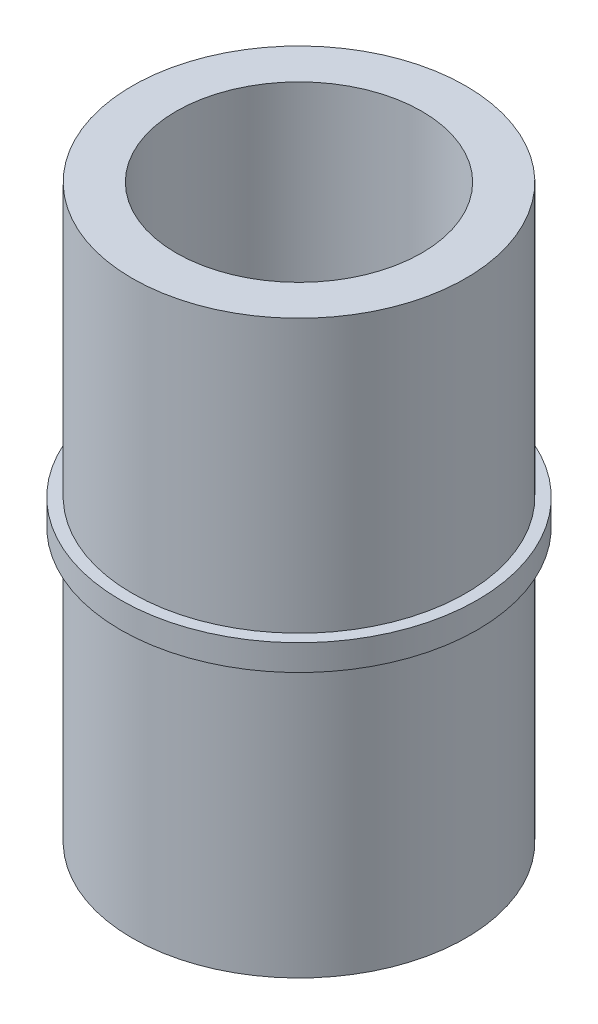
ISO-10303-21;
HEADER;
FILE_DESCRIPTION(('STEP AP214'),'2;1');
FILE_NAME('part.step','',(''),(''),'','','');
FILE_SCHEMA(('AUTOMOTIVE_DESIGN { 1 0 10303 214 1 1 1 1 }'));
ENDSEC;
DATA;
#1=APPLICATION_CONTEXT('core data for automotive mechanical design processes');
#2=APPLICATION_PROTOCOL_DEFINITION('international standard','automotive_design',2000,#1);
#3=PRODUCT_CONTEXT('',#1,'mechanical');
#4=PRODUCT('Part','Part','',(#3));
#5=PRODUCT_RELATED_PRODUCT_CATEGORY('part','',(#4));
#6=PRODUCT_DEFINITION_FORMATION('','',#4);
#7=PRODUCT_DEFINITION_CONTEXT('part definition',#1,'design');
#8=PRODUCT_DEFINITION('design','',#6,#7);
#9=PRODUCT_DEFINITION_SHAPE('','',#8);
#10=(LENGTH_UNIT() NAMED_UNIT(*) SI_UNIT(.MILLI.,.METRE.));
#11=(NAMED_UNIT(*) PLANE_ANGLE_UNIT() SI_UNIT($,.RADIAN.));
#12=(NAMED_UNIT(*) SI_UNIT($,.STERADIAN.) SOLID_ANGLE_UNIT());
#13=UNCERTAINTY_MEASURE_WITH_UNIT(LENGTH_MEASURE(1.E-05),#10,'distance_accuracy_value','');
#14=(GEOMETRIC_REPRESENTATION_CONTEXT(3) GLOBAL_UNCERTAINTY_ASSIGNED_CONTEXT((#13)) GLOBAL_UNIT_ASSIGNED_CONTEXT((#10,
#11,#12)) REPRESENTATION_CONTEXT('',''));
#15=CARTESIAN_POINT('',(0.,0.,0.));
#16=DIRECTION('',(0.,0.,1.));
#17=DIRECTION('',(1.,0.,0.));
#18=AXIS2_PLACEMENT_3D('',#15,#16,#17);
#19=CARTESIAN_POINT('',(6.45,-11.05,0.));
#20=DIRECTION('',(0.,-1.,0.));
#21=DIRECTION('',(0.,0.,-1.));
#22=AXIS2_PLACEMENT_3D('',#19,#20,#21);
#23=PLANE('',#22);
#24=CARTESIAN_POINT('',(0.,-11.05,0.));
#25=DIRECTION('',(0.,-1.,0.));
#26=DIRECTION('',(0.,0.,-1.));
#27=AXIS2_PLACEMENT_3D('',#24,#25,#26);
#28=CIRCLE('',#27,6.45);
#29=CARTESIAN_POINT('',(0.,-11.05,-6.45));
#30=VERTEX_POINT('',#29);
#31=EDGE_CURVE('E72',#30,#30,#28,.T.);
#32=ORIENTED_EDGE('',*,*,#31,.T.);
#33=EDGE_LOOP('',(#32));
#34=FACE_BOUND('',#33,.T.);
#35=CARTESIAN_POINT('',(0.,-11.05,0.));
#36=DIRECTION('',(0.,-1.,0.));
#37=DIRECTION('',(0.,0.,-1.));
#38=AXIS2_PLACEMENT_3D('',#35,#36,#37);
#39=CIRCLE('',#38,4.75);
#40=CARTESIAN_POINT('',(0.,-11.05,-4.75));
#41=VERTEX_POINT('',#40);
#42=EDGE_CURVE('E10',#41,#41,#39,.T.);
#43=ORIENTED_EDGE('',*,*,#42,.F.);
#44=EDGE_LOOP('',(#43));
#45=FACE_BOUND('',#44,.T.);
#46=ADVANCED_FACE('F37',(#34,#45),#23,.T.);
#47=CARTESIAN_POINT('',(0.,-5.67091836734694,0.));
#48=DIRECTION('',(0.,-1.,0.));
#49=DIRECTION('',(0.,0.,-1.));
#50=AXIS2_PLACEMENT_3D('',#47,#48,#49);
#51=CYLINDRICAL_SURFACE('',#50,4.75);
#52=ORIENTED_EDGE('',*,*,#42,.T.);
#53=EDGE_LOOP('',(#52));
#54=FACE_BOUND('',#53,.T.);
#55=CARTESIAN_POINT('',(0.,11.05,0.));
#56=DIRECTION('',(0.,-1.,0.));
#57=DIRECTION('',(0.,0.,-1.));
#58=AXIS2_PLACEMENT_3D('',#55,#56,#57);
#59=CIRCLE('',#58,4.75);
#60=CARTESIAN_POINT('',(0.,11.05,-4.75));
#61=VERTEX_POINT('',#60);
#62=EDGE_CURVE('E44',#61,#61,#59,.T.);
#63=ORIENTED_EDGE('',*,*,#62,.F.);
#64=EDGE_LOOP('',(#63));
#65=FACE_BOUND('',#64,.T.);
#66=ADVANCED_FACE('F91',(#54,#65),#51,.F.);
#67=CARTESIAN_POINT('',(4.75,11.05,0.));
#68=DIRECTION('',(0.,1.,0.));
#69=DIRECTION('',(0.,0.,1.));
#70=AXIS2_PLACEMENT_3D('',#67,#68,#69);
#71=PLANE('',#70);
#72=ORIENTED_EDGE('',*,*,#62,.T.);
#73=EDGE_LOOP('',(#72));
#74=FACE_BOUND('',#73,.T.);
#75=CARTESIAN_POINT('',(0.,11.05,0.));
#76=DIRECTION('',(0.,-1.,0.));
#77=DIRECTION('',(0.,0.,-1.));
#78=AXIS2_PLACEMENT_3D('',#75,#76,#77);
#79=CIRCLE('',#78,6.45);
#80=CARTESIAN_POINT('',(0.,11.05,-6.45));
#81=VERTEX_POINT('',#80);
#82=EDGE_CURVE('E49',#81,#81,#79,.T.);
#83=ORIENTED_EDGE('',*,*,#82,.F.);
#84=EDGE_LOOP('',(#83));
#85=FACE_BOUND('',#84,.T.);
#86=ADVANCED_FACE('F95',(#74,#85),#71,.T.);
#87=CARTESIAN_POINT('',(0.,-5.67091836734694,0.));
#88=DIRECTION('',(0.,-1.,0.));
#89=DIRECTION('',(0.,0.,-1.));
#90=AXIS2_PLACEMENT_3D('',#87,#88,#89);
#91=CYLINDRICAL_SURFACE('',#90,6.45);
#92=ORIENTED_EDGE('',*,*,#82,.T.);
#93=EDGE_LOOP('',(#92));
#94=FACE_BOUND('',#93,.T.);
#95=CARTESIAN_POINT('',(0.,0.5,0.));
#96=DIRECTION('',(0.,-1.,0.));
#97=DIRECTION('',(0.,0.,-1.));
#98=AXIS2_PLACEMENT_3D('',#95,#96,#97);
#99=CIRCLE('',#98,6.45);
#100=CARTESIAN_POINT('',(0.,0.5,-6.45));
#101=VERTEX_POINT('',#100);
#102=EDGE_CURVE('E54',#101,#101,#99,.T.);
#103=ORIENTED_EDGE('',*,*,#102,.F.);
#104=EDGE_LOOP('',(#103));
#105=FACE_BOUND('',#104,.T.);
#106=ADVANCED_FACE('F99',(#94,#105),#91,.T.);
#107=CARTESIAN_POINT('',(6.45,0.5,0.));
#108=DIRECTION('',(0.,1.,0.));
#109=DIRECTION('',(0.,0.,1.));
#110=AXIS2_PLACEMENT_3D('',#107,#108,#109);
#111=PLANE('',#110);
#112=ORIENTED_EDGE('',*,*,#102,.T.);
#113=EDGE_LOOP('',(#112));
#114=FACE_BOUND('',#113,.T.);
#115=CARTESIAN_POINT('',(0.,0.5,0.));
#116=DIRECTION('',(0.,-1.,0.));
#117=DIRECTION('',(0.,0.,-1.));
#118=AXIS2_PLACEMENT_3D('',#115,#116,#117);
#119=CIRCLE('',#118,6.9);
#120=CARTESIAN_POINT('',(0.,0.5,-6.9));
#121=VERTEX_POINT('',#120);
#122=EDGE_CURVE('E60',#121,#121,#119,.T.);
#123=ORIENTED_EDGE('',*,*,#122,.F.);
#124=EDGE_LOOP('',(#123));
#125=FACE_BOUND('',#124,.T.);
#126=ADVANCED_FACE('F105',(#114,#125),#111,.T.);
#127=CARTESIAN_POINT('',(0.,-5.67091836734694,0.));
#128=DIRECTION('',(0.,-1.,0.));
#129=DIRECTION('',(0.,0.,-1.));
#130=AXIS2_PLACEMENT_3D('',#127,#128,#129);
#131=CYLINDRICAL_SURFACE('',#130,6.9);
#132=ORIENTED_EDGE('',*,*,#122,.T.);
#133=EDGE_LOOP('',(#132));
#134=FACE_BOUND('',#133,.T.);
#135=CARTESIAN_POINT('',(0.,-0.5,0.));
#136=DIRECTION('',(0.,-1.,0.));
#137=DIRECTION('',(0.,0.,-1.));
#138=AXIS2_PLACEMENT_3D('',#135,#136,#137);
#139=CIRCLE('',#138,6.9);
#140=CARTESIAN_POINT('',(0.,-0.5,-6.9));
#141=VERTEX_POINT('',#140);
#142=EDGE_CURVE('E64',#141,#141,#139,.T.);
#143=ORIENTED_EDGE('',*,*,#142,.F.);
#144=EDGE_LOOP('',(#143));
#145=FACE_BOUND('',#144,.T.);
#146=ADVANCED_FACE('F87',(#134,#145),#131,.T.);
#147=CARTESIAN_POINT('',(6.9,-0.5,0.));
#148=DIRECTION('',(0.,-1.,0.));
#149=DIRECTION('',(0.,0.,-1.));
#150=AXIS2_PLACEMENT_3D('',#147,#148,#149);
#151=PLANE('',#150);
#152=ORIENTED_EDGE('',*,*,#142,.T.);
#153=EDGE_LOOP('',(#152));
#154=FACE_BOUND('',#153,.T.);
#155=CARTESIAN_POINT('',(0.,-0.5,0.));
#156=DIRECTION('',(0.,-1.,0.));
#157=DIRECTION('',(0.,0.,-1.));
#158=AXIS2_PLACEMENT_3D('',#155,#156,#157);
#159=CIRCLE('',#158,6.45);
#160=CARTESIAN_POINT('',(0.,-0.5,-6.45));
#161=VERTEX_POINT('',#160);
#162=EDGE_CURVE('E68',#161,#161,#159,.T.);
#163=ORIENTED_EDGE('',*,*,#162,.F.);
#164=EDGE_LOOP('',(#163));
#165=FACE_BOUND('',#164,.T.);
#166=ADVANCED_FACE('F81',(#154,#165),#151,.T.);
#167=CARTESIAN_POINT('',(0.,-5.67091836734694,0.));
#168=DIRECTION('',(0.,-1.,0.));
#169=DIRECTION('',(0.,0.,-1.));
#170=AXIS2_PLACEMENT_3D('',#167,#168,#169);
#171=CYLINDRICAL_SURFACE('',#170,6.45);
#172=ORIENTED_EDGE('',*,*,#162,.T.);
#173=EDGE_LOOP('',(#172));
#174=FACE_BOUND('',#173,.T.);
#175=ORIENTED_EDGE('',*,*,#31,.F.);
#176=EDGE_LOOP('',(#175));
#177=FACE_BOUND('',#176,.T.);
#178=ADVANCED_FACE('F79',(#174,#177),#171,.T.);
#179=CLOSED_SHELL('',(#46,#66,#86,#106,#126,#146,#166,#178));
#180=MANIFOLD_SOLID_BREP('B2',#179);
#181=ADVANCED_BREP_SHAPE_REPRESENTATION('',(#18,#180),#14);
#182=SHAPE_DEFINITION_REPRESENTATION(#9,#181);
ENDSEC;
END-ISO-10303-21;
